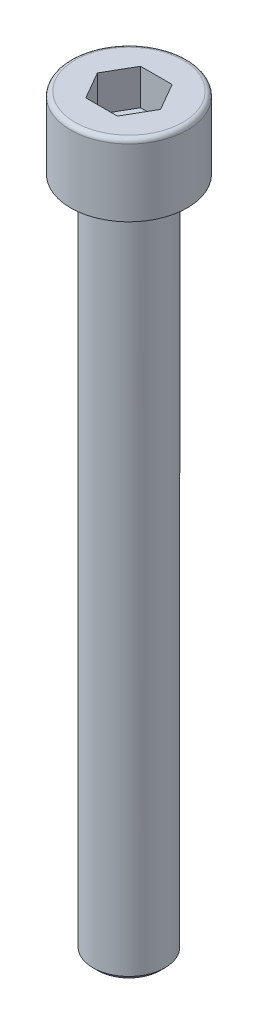
ISO-10303-21;
HEADER;
FILE_DESCRIPTION(('STEP AP214'),'2;1');
FILE_NAME('part.step','',(''),(''),'','','');
FILE_SCHEMA(('AUTOMOTIVE_DESIGN { 1 0 10303 214 1 1 1 1 }'));
ENDSEC;
DATA;
#1=APPLICATION_CONTEXT('core data for automotive mechanical design processes');
#2=APPLICATION_PROTOCOL_DEFINITION('international standard','automotive_design',2000,#1);
#3=PRODUCT_CONTEXT('',#1,'mechanical');
#4=PRODUCT('Part','Part','',(#3));
#5=PRODUCT_RELATED_PRODUCT_CATEGORY('part','',(#4));
#6=PRODUCT_DEFINITION_FORMATION('','',#4);
#7=PRODUCT_DEFINITION_CONTEXT('part definition',#1,'design');
#8=PRODUCT_DEFINITION('design','',#6,#7);
#9=PRODUCT_DEFINITION_SHAPE('','',#8);
#10=(LENGTH_UNIT() NAMED_UNIT(*) SI_UNIT(.MILLI.,.METRE.));
#11=(NAMED_UNIT(*) PLANE_ANGLE_UNIT() SI_UNIT($,.RADIAN.));
#12=(NAMED_UNIT(*) SI_UNIT($,.STERADIAN.) SOLID_ANGLE_UNIT());
#13=UNCERTAINTY_MEASURE_WITH_UNIT(LENGTH_MEASURE(1.E-05),#10,'distance_accuracy_value','');
#14=(GEOMETRIC_REPRESENTATION_CONTEXT(3) GLOBAL_UNCERTAINTY_ASSIGNED_CONTEXT((#13)) GLOBAL_UNIT_ASSIGNED_CONTEXT((#10,
#11,#12)) REPRESENTATION_CONTEXT('',''));
#15=CARTESIAN_POINT('',(0.,0.,0.));
#16=DIRECTION('',(0.,0.,1.));
#17=DIRECTION('',(1.,0.,0.));
#18=AXIS2_PLACEMENT_3D('',#15,#16,#17);
#19=CARTESIAN_POINT('',(0.,8.,0.));
#20=DIRECTION('',(0.,-1.,0.));
#21=DIRECTION('',(0.,0.,-1.));
#22=AXIS2_PLACEMENT_3D('',#19,#20,#21);
#23=CYLINDRICAL_SURFACE('',#22,6.5);
#24=CARTESIAN_POINT('',(0.,7.5,0.));
#25=DIRECTION('',(0.,1.,0.));
#26=DIRECTION('',(0.,0.,1.));
#27=AXIS2_PLACEMENT_3D('',#24,#25,#26);
#28=CIRCLE('',#27,6.5);
#29=CARTESIAN_POINT('',(0.,7.5,6.5));
#30=VERTEX_POINT('',#29);
#31=EDGE_CURVE('E146',#30,#30,#28,.F.);
#32=ORIENTED_EDGE('',*,*,#31,.T.);
#33=EDGE_LOOP('',(#32));
#34=FACE_BOUND('',#33,.T.);
#35=CARTESIAN_POINT('',(0.,0.,0.));
#36=DIRECTION('',(0.,1.,0.));
#37=DIRECTION('',(0.,0.,1.));
#38=AXIS2_PLACEMENT_3D('',#35,#36,#37);
#39=CIRCLE('',#38,6.5);
#40=CARTESIAN_POINT('',(0.,0.,6.5));
#41=VERTEX_POINT('',#40);
#42=EDGE_CURVE('E135',#41,#41,#39,.T.);
#43=ORIENTED_EDGE('',*,*,#42,.T.);
#44=EDGE_LOOP('',(#43));
#45=FACE_BOUND('',#44,.T.);
#46=ADVANCED_FACE('F33',(#34,#45),#23,.T.);
#47=CARTESIAN_POINT('',(0.,8.,0.));
#48=DIRECTION('',(0.,1.,0.));
#49=DIRECTION('',(0.,0.,1.));
#50=AXIS2_PLACEMENT_3D('',#47,#48,#49);
#51=PLANE('',#50);
#52=CARTESIAN_POINT('',(0.,8.,0.));
#53=DIRECTION('',(0.,1.,0.));
#54=DIRECTION('',(0.,0.,1.));
#55=AXIS2_PLACEMENT_3D('',#52,#53,#54);
#56=CIRCLE('',#55,6.);
#57=CARTESIAN_POINT('',(0.,8.,6.));
#58=VERTEX_POINT('',#57);
#59=EDGE_CURVE('E143',#58,#58,#56,.T.);
#60=ORIENTED_EDGE('',*,*,#59,.T.);
#61=EDGE_LOOP('',(#60));
#62=FACE_BOUND('',#61,.T.);
#63=DIRECTION('',(0.5,0.,-0.866025403784439));
#64=VECTOR('',#63,1.);
#65=CARTESIAN_POINT('',(1.75803156968241,8.,3.045));
#66=LINE('',#65,#64);
#67=CARTESIAN_POINT('',(1.75803156968241,8.,3.045));
#68=VERTEX_POINT('',#67);
#69=CARTESIAN_POINT('',(3.51606313936482,8.,0.));
#70=VERTEX_POINT('',#69);
#71=EDGE_CURVE('E48',#68,#70,#66,.T.);
#72=ORIENTED_EDGE('',*,*,#71,.F.);
#73=DIRECTION('',(1.,0.,0.));
#74=VECTOR('',#73,1.);
#75=CARTESIAN_POINT('',(-1.75803156968241,8.,3.045));
#76=LINE('',#75,#74);
#77=CARTESIAN_POINT('',(-1.75803156968241,8.,3.045));
#78=VERTEX_POINT('',#77);
#79=EDGE_CURVE('E131',#78,#68,#76,.T.);
#80=ORIENTED_EDGE('',*,*,#79,.F.);
#81=DIRECTION('',(0.5,0.,0.866025403784438));
#82=VECTOR('',#81,1.);
#83=CARTESIAN_POINT('',(-3.51606313936482,8.,0.));
#84=LINE('',#83,#82);
#85=CARTESIAN_POINT('',(-3.51606313936482,8.,0.));
#86=VERTEX_POINT('',#85);
#87=EDGE_CURVE('E129',#86,#78,#84,.T.);
#88=ORIENTED_EDGE('',*,*,#87,.F.);
#89=DIRECTION('',(-0.5,0.,0.866025403784439));
#90=VECTOR('',#89,1.);
#91=CARTESIAN_POINT('',(-1.75803156968241,8.,-3.045));
#92=LINE('',#91,#90);
#93=CARTESIAN_POINT('',(-1.75803156968241,8.,-3.045));
#94=VERTEX_POINT('',#93);
#95=EDGE_CURVE('E96',#94,#86,#92,.T.);
#96=ORIENTED_EDGE('',*,*,#95,.F.);
#97=DIRECTION('',(-1.,0.,0.));
#98=VECTOR('',#97,1.);
#99=CARTESIAN_POINT('',(1.75803156968241,8.,-3.045));
#100=LINE('',#99,#98);
#101=CARTESIAN_POINT('',(1.75803156968241,8.,-3.045));
#102=VERTEX_POINT('',#101);
#103=EDGE_CURVE('E125',#102,#94,#100,.T.);
#104=ORIENTED_EDGE('',*,*,#103,.F.);
#105=DIRECTION('',(-0.5,0.,-0.866025403784439));
#106=VECTOR('',#105,1.);
#107=CARTESIAN_POINT('',(3.51606313936482,8.,0.));
#108=LINE('',#107,#106);
#109=EDGE_CURVE('E122',#70,#102,#108,.T.);
#110=ORIENTED_EDGE('',*,*,#109,.F.);
#111=EDGE_LOOP('',(#72,#80,#88,#96,#104,#110));
#112=FACE_BOUND('',#111,.T.);
#113=ADVANCED_FACE('F168',(#62,#112),#51,.T.);
#114=CARTESIAN_POINT('',(0.,0.,0.));
#115=DIRECTION('',(0.,1.,0.));
#116=DIRECTION('',(0.,0.,1.));
#117=AXIS2_PLACEMENT_3D('',#114,#115,#116);
#118=PLANE('',#117);
#119=CARTESIAN_POINT('',(0.,0.,0.));
#120=DIRECTION('',(0.,1.,0.));
#121=DIRECTION('',(0.,0.,1.));
#122=AXIS2_PLACEMENT_3D('',#119,#120,#121);
#123=CIRCLE('',#122,4.5);
#124=CARTESIAN_POINT('',(0.,0.,4.5));
#125=VERTEX_POINT('',#124);
#126=EDGE_CURVE('E152',#125,#125,#123,.T.);
#127=ORIENTED_EDGE('',*,*,#126,.T.);
#128=EDGE_LOOP('',(#127));
#129=FACE_BOUND('',#128,.T.);
#130=ORIENTED_EDGE('',*,*,#42,.F.);
#131=EDGE_LOOP('',(#130));
#132=FACE_BOUND('',#131,.T.);
#133=ADVANCED_FACE('F174',(#129,#132),#118,.F.);
#134=CARTESIAN_POINT('',(1.75803156968241,4.,3.045));
#135=DIRECTION('',(0.866025403784439,0.,0.5));
#136=DIRECTION('',(0.5,0.,-0.866025403784439));
#137=AXIS2_PLACEMENT_3D('',#134,#135,#136);
#138=PLANE('',#137);
#139=ORIENTED_EDGE('',*,*,#71,.T.);
#140=DIRECTION('',(0.,1.,0.));
#141=VECTOR('',#140,1.);
#142=CARTESIAN_POINT('',(3.51606313936482,4.,0.));
#143=LINE('',#142,#141);
#144=CARTESIAN_POINT('',(3.51606313936482,4.,0.));
#145=VERTEX_POINT('',#144);
#146=EDGE_CURVE('E78',#145,#70,#143,.T.);
#147=ORIENTED_EDGE('',*,*,#146,.F.);
#148=DIRECTION('',(0.5,0.,-0.866025403784439));
#149=VECTOR('',#148,1.);
#150=CARTESIAN_POINT('',(1.75803156968241,4.,3.045));
#151=LINE('',#150,#149);
#152=CARTESIAN_POINT('',(1.75803156968241,4.,3.045));
#153=VERTEX_POINT('',#152);
#154=EDGE_CURVE('E133',#153,#145,#151,.T.);
#155=ORIENTED_EDGE('',*,*,#154,.F.);
#156=DIRECTION('',(0.,1.,0.));
#157=VECTOR('',#156,1.);
#158=CARTESIAN_POINT('',(1.75803156968241,4.,3.045));
#159=LINE('',#158,#157);
#160=EDGE_CURVE('E56',#153,#68,#159,.T.);
#161=ORIENTED_EDGE('',*,*,#160,.T.);
#162=EDGE_LOOP('',(#139,#147,#155,#161));
#163=FACE_BOUND('',#162,.T.);
#164=ADVANCED_FACE('F201',(#163),#138,.F.);
#165=CARTESIAN_POINT('',(-1.75803156968241,4.,3.045));
#166=DIRECTION('',(0.,0.,1.));
#167=DIRECTION('',(1.,0.,0.));
#168=AXIS2_PLACEMENT_3D('',#165,#166,#167);
#169=PLANE('',#168);
#170=ORIENTED_EDGE('',*,*,#79,.T.);
#171=ORIENTED_EDGE('',*,*,#160,.F.);
#172=DIRECTION('',(1.,0.,0.));
#173=VECTOR('',#172,1.);
#174=CARTESIAN_POINT('',(-1.75803156968241,4.,3.045));
#175=LINE('',#174,#173);
#176=CARTESIAN_POINT('',(-1.75803156968241,4.,3.045));
#177=VERTEX_POINT('',#176);
#178=EDGE_CURVE('E108',#177,#153,#175,.T.);
#179=ORIENTED_EDGE('',*,*,#178,.F.);
#180=DIRECTION('',(0.,1.,0.));
#181=VECTOR('',#180,1.);
#182=CARTESIAN_POINT('',(-1.75803156968241,4.,3.045));
#183=LINE('',#182,#181);
#184=EDGE_CURVE('E100',#177,#78,#183,.T.);
#185=ORIENTED_EDGE('',*,*,#184,.T.);
#186=EDGE_LOOP('',(#170,#171,#179,#185));
#187=FACE_BOUND('',#186,.T.);
#188=ADVANCED_FACE('F203',(#187),#169,.F.);
#189=CARTESIAN_POINT('',(-3.51606313936482,4.,0.));
#190=DIRECTION('',(-0.866025403784439,0.,0.5));
#191=DIRECTION('',(0.5,0.,0.866025403784439));
#192=AXIS2_PLACEMENT_3D('',#189,#190,#191);
#193=PLANE('',#192);
#194=ORIENTED_EDGE('',*,*,#87,.T.);
#195=ORIENTED_EDGE('',*,*,#184,.F.);
#196=DIRECTION('',(0.5,0.,0.866025403784438));
#197=VECTOR('',#196,1.);
#198=CARTESIAN_POINT('',(-3.51606313936482,4.,0.));
#199=LINE('',#198,#197);
#200=CARTESIAN_POINT('',(-3.51606313936482,4.,0.));
#201=VERTEX_POINT('',#200);
#202=EDGE_CURVE('E104',#201,#177,#199,.T.);
#203=ORIENTED_EDGE('',*,*,#202,.F.);
#204=DIRECTION('',(0.,1.,0.));
#205=VECTOR('',#204,1.);
#206=CARTESIAN_POINT('',(-3.51606313936482,4.,0.));
#207=LINE('',#206,#205);
#208=EDGE_CURVE('E89',#201,#86,#207,.T.);
#209=ORIENTED_EDGE('',*,*,#208,.T.);
#210=EDGE_LOOP('',(#194,#195,#203,#209));
#211=FACE_BOUND('',#210,.T.);
#212=ADVANCED_FACE('F105',(#211),#193,.F.);
#213=CARTESIAN_POINT('',(-1.75803156968241,4.,-3.045));
#214=DIRECTION('',(-0.866025403784439,0.,-0.5));
#215=DIRECTION('',(-0.5,0.,0.866025403784439));
#216=AXIS2_PLACEMENT_3D('',#213,#214,#215);
#217=PLANE('',#216);
#218=ORIENTED_EDGE('',*,*,#95,.T.);
#219=ORIENTED_EDGE('',*,*,#208,.F.);
#220=DIRECTION('',(-0.5,0.,0.866025403784439));
#221=VECTOR('',#220,1.);
#222=CARTESIAN_POINT('',(-1.75803156968241,4.,-3.045));
#223=LINE('',#222,#221);
#224=CARTESIAN_POINT('',(-1.75803156968241,4.,-3.045));
#225=VERTEX_POINT('',#224);
#226=EDGE_CURVE('E93',#225,#201,#223,.T.);
#227=ORIENTED_EDGE('',*,*,#226,.F.);
#228=DIRECTION('',(0.,1.,0.));
#229=VECTOR('',#228,1.);
#230=CARTESIAN_POINT('',(-1.75803156968241,4.,-3.045));
#231=LINE('',#230,#229);
#232=EDGE_CURVE('E101',#225,#94,#231,.T.);
#233=ORIENTED_EDGE('',*,*,#232,.T.);
#234=EDGE_LOOP('',(#218,#219,#227,#233));
#235=FACE_BOUND('',#234,.T.);
#236=ADVANCED_FACE('F91',(#235),#217,.F.);
#237=CARTESIAN_POINT('',(1.75803156968241,4.,-3.045));
#238=DIRECTION('',(0.,0.,-1.));
#239=DIRECTION('',(-1.,0.,0.));
#240=AXIS2_PLACEMENT_3D('',#237,#238,#239);
#241=PLANE('',#240);
#242=ORIENTED_EDGE('',*,*,#103,.T.);
#243=ORIENTED_EDGE('',*,*,#232,.F.);
#244=DIRECTION('',(-1.,0.,0.));
#245=VECTOR('',#244,1.);
#246=CARTESIAN_POINT('',(1.75803156968241,4.,-3.045));
#247=LINE('',#246,#245);
#248=CARTESIAN_POINT('',(1.75803156968241,4.,-3.045));
#249=VERTEX_POINT('',#248);
#250=EDGE_CURVE('E114',#249,#225,#247,.T.);
#251=ORIENTED_EDGE('',*,*,#250,.F.);
#252=DIRECTION('',(0.,1.,0.));
#253=VECTOR('',#252,1.);
#254=CARTESIAN_POINT('',(1.75803156968241,4.,-3.045));
#255=LINE('',#254,#253);
#256=EDGE_CURVE('E138',#249,#102,#255,.T.);
#257=ORIENTED_EDGE('',*,*,#256,.T.);
#258=EDGE_LOOP('',(#242,#243,#251,#257));
#259=FACE_BOUND('',#258,.T.);
#260=ADVANCED_FACE('F214',(#259),#241,.F.);
#261=CARTESIAN_POINT('',(3.51606313936482,4.,0.));
#262=DIRECTION('',(0.866025403784439,0.,-0.5));
#263=DIRECTION('',(-0.5,0.,-0.866025403784439));
#264=AXIS2_PLACEMENT_3D('',#261,#262,#263);
#265=PLANE('',#264);
#266=ORIENTED_EDGE('',*,*,#109,.T.);
#267=ORIENTED_EDGE('',*,*,#256,.F.);
#268=DIRECTION('',(-0.5,0.,-0.866025403784439));
#269=VECTOR('',#268,1.);
#270=CARTESIAN_POINT('',(3.51606313936482,4.,0.));
#271=LINE('',#270,#269);
#272=EDGE_CURVE('E116',#145,#249,#271,.T.);
#273=ORIENTED_EDGE('',*,*,#272,.F.);
#274=ORIENTED_EDGE('',*,*,#146,.T.);
#275=EDGE_LOOP('',(#266,#267,#273,#274));
#276=FACE_BOUND('',#275,.T.);
#277=ADVANCED_FACE('F190',(#276),#265,.F.);
#278=CARTESIAN_POINT('',(0.,4.,0.));
#279=DIRECTION('',(0.,1.,0.));
#280=DIRECTION('',(0.,0.,1.));
#281=AXIS2_PLACEMENT_3D('',#278,#279,#280);
#282=PLANE('',#281);
#283=ORIENTED_EDGE('',*,*,#154,.T.);
#284=ORIENTED_EDGE('',*,*,#272,.T.);
#285=ORIENTED_EDGE('',*,*,#250,.T.);
#286=ORIENTED_EDGE('',*,*,#226,.T.);
#287=ORIENTED_EDGE('',*,*,#202,.T.);
#288=ORIENTED_EDGE('',*,*,#178,.T.);
#289=EDGE_LOOP('',(#283,#284,#285,#286,#287,#288));
#290=FACE_BOUND('',#289,.T.);
#291=ADVANCED_FACE('F111',(#290),#282,.T.);
#292=CARTESIAN_POINT('',(0.,7.5,0.));
#293=DIRECTION('',(0.,1.,0.));
#294=DIRECTION('',(0.,0.,1.));
#295=AXIS2_PLACEMENT_3D('',#292,#293,#294);
#296=TOROIDAL_SURFACE('',#295,6.,0.5);
#297=ORIENTED_EDGE('',*,*,#31,.F.);
#298=EDGE_LOOP('',(#297));
#299=FACE_BOUND('',#298,.T.);
#300=ORIENTED_EDGE('',*,*,#59,.F.);
#301=EDGE_LOOP('',(#300));
#302=FACE_BOUND('',#301,.T.);
#303=ADVANCED_FACE('F180',(#299,#302),#296,.T.);
#304=CARTESIAN_POINT('',(0.,-75.,0.));
#305=DIRECTION('',(0.,1.,0.));
#306=DIRECTION('',(0.,0.,1.));
#307=AXIS2_PLACEMENT_3D('',#304,#305,#306);
#308=CYLINDRICAL_SURFACE('',#307,4.);
#309=CARTESIAN_POINT('',(0.,-74.5,0.));
#310=DIRECTION('',(0.,-1.,0.));
#311=DIRECTION('',(0.,0.,-1.));
#312=AXIS2_PLACEMENT_3D('',#309,#310,#311);
#313=CIRCLE('',#312,4.);
#314=CARTESIAN_POINT('',(0.,-74.5,-4.));
#315=VERTEX_POINT('',#314);
#316=EDGE_CURVE('E11',#315,#315,#313,.F.);
#317=ORIENTED_EDGE('',*,*,#316,.T.);
#318=EDGE_LOOP('',(#317));
#319=FACE_BOUND('',#318,.T.);
#320=CARTESIAN_POINT('',(0.,-0.5,0.));
#321=DIRECTION('',(0.,1.,0.));
#322=DIRECTION('',(0.,0.,1.));
#323=AXIS2_PLACEMENT_3D('',#320,#321,#322);
#324=CIRCLE('',#323,4.);
#325=CARTESIAN_POINT('',(0.,-0.5,4.));
#326=VERTEX_POINT('',#325);
#327=EDGE_CURVE('E149',#326,#326,#324,.F.);
#328=ORIENTED_EDGE('',*,*,#327,.T.);
#329=EDGE_LOOP('',(#328));
#330=FACE_BOUND('',#329,.T.);
#331=ADVANCED_FACE('F182',(#319,#330),#308,.T.);
#332=CARTESIAN_POINT('',(0.,-75.,0.));
#333=DIRECTION('',(0.,-1.,0.));
#334=DIRECTION('',(0.,0.,-1.));
#335=AXIS2_PLACEMENT_3D('',#332,#333,#334);
#336=PLANE('',#335);
#337=CARTESIAN_POINT('',(0.,-75.,0.));
#338=DIRECTION('',(0.,-1.,0.));
#339=DIRECTION('',(0.,0.,-1.));
#340=AXIS2_PLACEMENT_3D('',#337,#338,#339);
#341=CIRCLE('',#340,3.50000000000001);
#342=CARTESIAN_POINT('',(0.,-75.,-3.50000000000001));
#343=VERTEX_POINT('',#342);
#344=EDGE_CURVE('E41',#343,#343,#341,.T.);
#345=ORIENTED_EDGE('',*,*,#344,.T.);
#346=EDGE_LOOP('',(#345));
#347=FACE_BOUND('',#346,.T.);
#348=ADVANCED_FACE('F157',(#347),#336,.T.);
#349=CARTESIAN_POINT('',(0.,-0.5,0.));
#350=DIRECTION('',(0.,1.,0.));
#351=DIRECTION('',(0.,0.,1.));
#352=AXIS2_PLACEMENT_3D('',#349,#350,#351);
#353=TOROIDAL_SURFACE('',#352,4.5,0.5);
#354=ORIENTED_EDGE('',*,*,#126,.F.);
#355=EDGE_LOOP('',(#354));
#356=FACE_BOUND('',#355,.T.);
#357=ORIENTED_EDGE('',*,*,#327,.F.);
#358=EDGE_LOOP('',(#357));
#359=FACE_BOUND('',#358,.T.);
#360=ADVANCED_FACE('F160',(#356,#359),#353,.F.);
#361=CARTESIAN_POINT('',(0.,-75.,0.));
#362=DIRECTION('',(0.,1.,0.));
#363=DIRECTION('',(0.,0.,1.));
#364=AXIS2_PLACEMENT_3D('',#361,#362,#363);
#365=CONICAL_SURFACE('',#364,3.50000000000001,0.785398163397452);
#366=ORIENTED_EDGE('',*,*,#316,.F.);
#367=EDGE_LOOP('',(#366));
#368=FACE_BOUND('',#367,.T.);
#369=ORIENTED_EDGE('',*,*,#344,.F.);
#370=EDGE_LOOP('',(#369));
#371=FACE_BOUND('',#370,.T.);
#372=ADVANCED_FACE('F35',(#368,#371),#365,.T.);
#373=CLOSED_SHELL('',(#46,#113,#133,#164,#188,#212,#236,#260,#277,#291,#303,#331,#348,#360,#372));
#374=MANIFOLD_SOLID_BREP('B2',#373);
#375=ADVANCED_BREP_SHAPE_REPRESENTATION('',(#18,#374),#14);
#376=SHAPE_DEFINITION_REPRESENTATION(#9,#375);
ENDSEC;
END-ISO-10303-21;
